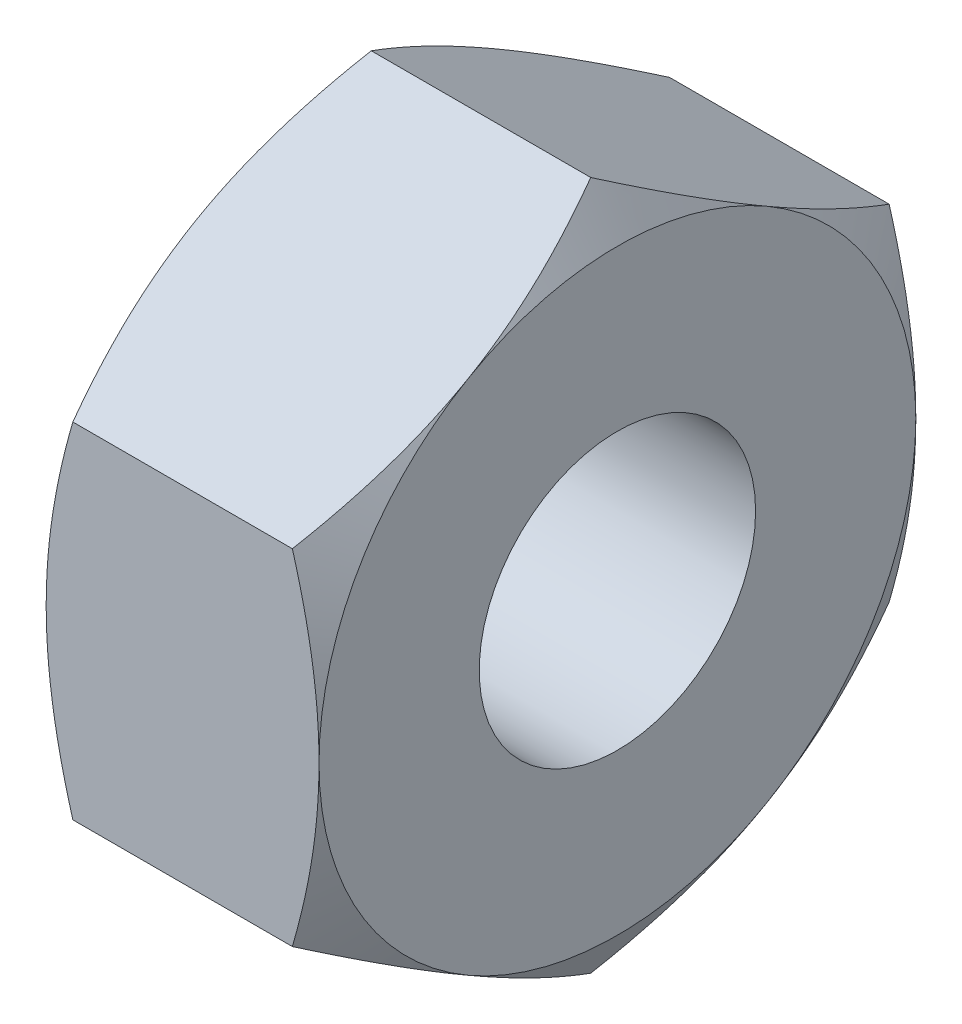
ISO-10303-21;
HEADER;
FILE_DESCRIPTION(('STEP AP214'),'2;1');
FILE_NAME('part.step','',(''),(''),'','','');
FILE_SCHEMA(('AUTOMOTIVE_DESIGN { 1 0 10303 214 1 1 1 1 }'));
ENDSEC;
DATA;
#1=APPLICATION_CONTEXT('core data for automotive mechanical design processes');
#2=APPLICATION_PROTOCOL_DEFINITION('international standard','automotive_design',2000,#1);
#3=PRODUCT_CONTEXT('',#1,'mechanical');
#4=PRODUCT('Part','Part','',(#3));
#5=PRODUCT_RELATED_PRODUCT_CATEGORY('part','',(#4));
#6=PRODUCT_DEFINITION_FORMATION('','',#4);
#7=PRODUCT_DEFINITION_CONTEXT('part definition',#1,'design');
#8=PRODUCT_DEFINITION('design','',#6,#7);
#9=PRODUCT_DEFINITION_SHAPE('','',#8);
#10=(LENGTH_UNIT() NAMED_UNIT(*) SI_UNIT(.MILLI.,.METRE.));
#11=(NAMED_UNIT(*) PLANE_ANGLE_UNIT() SI_UNIT($,.RADIAN.));
#12=(NAMED_UNIT(*) SI_UNIT($,.STERADIAN.) SOLID_ANGLE_UNIT());
#13=UNCERTAINTY_MEASURE_WITH_UNIT(LENGTH_MEASURE(1.E-05),#10,'distance_accuracy_value','');
#14=(GEOMETRIC_REPRESENTATION_CONTEXT(3) GLOBAL_UNCERTAINTY_ASSIGNED_CONTEXT((#13)) GLOBAL_UNIT_ASSIGNED_CONTEXT((#10,
#11,#12)) REPRESENTATION_CONTEXT('',''));
#15=CARTESIAN_POINT('',(0.,0.,0.));
#16=DIRECTION('',(0.,0.,1.));
#17=DIRECTION('',(1.,0.,0.));
#18=AXIS2_PLACEMENT_3D('',#15,#16,#17);
#19=CARTESIAN_POINT('',(3.2,2.02072594216369,-3.5));
#20=DIRECTION('',(0.,-0.866025403784439,0.5));
#21=DIRECTION('',(0.,-0.5,-0.866025403784439));
#22=AXIS2_PLACEMENT_3D('',#19,#20,#21);
#23=PLANE('',#22);
#24=CARTESIAN_POINT('',(2.88732593930663,2.02061047210985,-3.5002));
#25=CARTESIAN_POINT('',(2.93861421101002,2.10941108799268,-3.34639282154755));
#26=CARTESIAN_POINT('',(2.9852590461838,2.1989782252291,-3.19125798916558));
#27=CARTESIAN_POINT('',(3.06667812446665,2.37966345361545,-2.87830199342322));
#28=CARTESIAN_POINT('',(3.10142356441544,2.47078475532383,-2.7204752692125));
#29=CARTESIAN_POINT('',(3.15550997281716,2.65189807961074,-2.40677778961987));
#30=CARTESIAN_POINT('',(3.17521091373962,2.741862235454,-2.2509553008393));
#31=CARTESIAN_POINT('',(3.19872986726274,2.92221386641056,-1.93857711279462));
#32=CARTESIAN_POINT('',(3.20256735545443,3.01260068598001,-1.78202254896576));
#33=CARTESIAN_POINT('',(3.19458469812302,3.1814939814933,-1.489490780079));
#34=CARTESIAN_POINT('',(3.18472456593039,3.26002573814993,-1.35346978754209));
#35=CARTESIAN_POINT('',(3.15347353310059,3.41657761679355,-1.082313979711));
#36=CARTESIAN_POINT('',(3.1320719567142,3.49459719728458,-0.947180102315312));
#37=CARTESIAN_POINT('',(3.07856959211942,3.65147186489429,-0.675465207594812));
#38=CARTESIAN_POINT('',(3.04624200555491,3.73030709667644,-0.538918580721662));
#39=CARTESIAN_POINT('',(2.972871066192,3.88680174018325,-0.267861907055496));
#40=CARTESIAN_POINT('',(2.93184495343013,3.96446315689009,-0.13334838753146));
#41=CARTESIAN_POINT('',(2.88732593930663,4.04156735438121,0.0002000000000068));
#42=B_SPLINE_CURVE_WITH_KNOTS('',3,(#24,#25,#26,#27,#28,#29,#30,#31,#32,#33,#34,#35,#36,#37,#38,
#39,#40,#41),.UNSPECIFIED.,.F.,.F.,(4,2,2,2,2,2,2,2,4),(0.,0.554793832886255,1.11092123814984,
1.65328467083219,2.19498204478404,2.66665130850861,3.13875761298268,3.6213361260051,
4.10296698719187),.UNSPECIFIED.);
#43=CARTESIAN_POINT('',(2.88739260883036,2.02072594216369,-3.5));
#44=VERTEX_POINT('',#43);
#45=CARTESIAN_POINT('',(3.2,3.03108891324553,-1.75));
#46=VERTEX_POINT('',#45);
#47=EDGE_CURVE('E108',#44,#46,#42,.T.);
#48=ORIENTED_EDGE('',*,*,#47,.F.);
#49=DIRECTION('',(-1.,0.,0.));
#50=VECTOR('',#49,1.);
#51=CARTESIAN_POINT('',(3.2,2.02072594216369,-3.5));
#52=LINE('',#51,#50);
#53=CARTESIAN_POINT('',(0.312607391169634,2.02072594216369,-3.5));
#54=VERTEX_POINT('',#53);
#55=EDGE_CURVE('E208',#44,#54,#52,.T.);
#56=ORIENTED_EDGE('',*,*,#55,.T.);
#57=CARTESIAN_POINT('',(0.312674060693368,4.04156735438121,0.000200000000007105));
#58=CARTESIAN_POINT('',(0.261385788989984,3.9527667384984,-0.153607178452447));
#59=CARTESIAN_POINT('',(0.214740953816199,3.86319960126198,-0.308742010834422));
#60=CARTESIAN_POINT('',(0.133321875533352,3.68251437287563,-0.62169800657678));
#61=CARTESIAN_POINT('',(0.0985764355845637,3.59139307116725,-0.779524730787494));
#62=CARTESIAN_POINT('',(0.0444900271828388,3.41027974688034,-1.09322221038013));
#63=CARTESIAN_POINT('',(0.0247890862603851,3.32031559103709,-1.24904469916069));
#64=CARTESIAN_POINT('',(0.00127013273725455,3.13996396008052,-1.56142288720537));
#65=CARTESIAN_POINT('',(-0.00256735545443886,3.04957714051106,-1.71797745103422));
#66=CARTESIAN_POINT('',(0.00541530187697411,2.88068384499777,-2.01050921992098));
#67=CARTESIAN_POINT('',(0.0152754340696072,2.80215208834115,-2.1465302124579));
#68=CARTESIAN_POINT('',(0.046526466899406,2.64560020969754,-2.41768602028899));
#69=CARTESIAN_POINT('',(0.0679280432857993,2.5675806292065,-2.55281989768468));
#70=CARTESIAN_POINT('',(0.121430407880577,2.41070596159679,-2.82453479240518));
#71=CARTESIAN_POINT('',(0.153757994445088,2.33187072981464,-2.96108141927833));
#72=CARTESIAN_POINT('',(0.227128933807994,2.17537608630784,-3.2321380929445));
#73=CARTESIAN_POINT('',(0.268155046569864,2.09771466960099,-3.36665161246853));
#74=CARTESIAN_POINT('',(0.312674060693362,2.02061047210986,-3.5002));
#75=B_SPLINE_CURVE_WITH_KNOTS('',3,(#57,#58,#59,#60,#61,#62,#63,#64,#65,#66,#67,#68,#69,#70,#71,
#72,#73,#74),.UNSPECIFIED.,.F.,.F.,(4,2,2,2,2,2,2,2,4),(0.,0.554793832886252,1.11092123814983,
1.65328467083218,2.19498204478403,2.6666513085086,3.13875761298267,3.62133612600509,
4.10296698719187),.UNSPECIFIED.);
#76=CARTESIAN_POINT('',(0.,3.03108891324553,-1.75));
#77=VERTEX_POINT('',#76);
#78=EDGE_CURVE('E246',#77,#54,#75,.T.);
#79=ORIENTED_EDGE('',*,*,#78,.F.);
#80=CARTESIAN_POINT('',(0.312607391169639,4.04145188432738,0.));
#81=VERTEX_POINT('',#80);
#82=EDGE_CURVE('E251',#81,#77,#75,.T.);
#83=ORIENTED_EDGE('',*,*,#82,.F.);
#84=DIRECTION('',(-1.,0.,0.));
#85=VECTOR('',#84,1.);
#86=CARTESIAN_POINT('',(3.2,4.04145188432738,0.));
#87=LINE('',#86,#85);
#88=CARTESIAN_POINT('',(2.88739260883036,4.04145188432738,0.));
#89=VERTEX_POINT('',#88);
#90=EDGE_CURVE('E131',#89,#81,#87,.T.);
#91=ORIENTED_EDGE('',*,*,#90,.F.);
#92=EDGE_CURVE('E118',#46,#89,#42,.T.);
#93=ORIENTED_EDGE('',*,*,#92,.F.);
#94=EDGE_LOOP('',(#48,#56,#79,#83,#91,#93));
#95=FACE_BOUND('',#94,.T.);
#96=ADVANCED_FACE('F16',(#95),#23,.F.);
#97=CARTESIAN_POINT('',(3.2,4.04145188432738,0.));
#98=DIRECTION('',(0.,-0.866025403784439,-0.5));
#99=DIRECTION('',(0.,0.5,-0.866025403784439));
#100=AXIS2_PLACEMENT_3D('',#97,#98,#99);
#101=PLANE('',#100);
#102=CARTESIAN_POINT('',(2.88732593930663,4.04156735438121,-0.000199999999992962));
#103=CARTESIAN_POINT('',(2.93861421101002,3.9527667384984,0.153607178452456));
#104=CARTESIAN_POINT('',(2.98525904618381,3.86319960126197,0.30874201083443));
#105=CARTESIAN_POINT('',(3.06667812446665,3.68251437287562,0.621698006576787));
#106=CARTESIAN_POINT('',(3.10142356441544,3.59139307116725,0.779524730787502));
#107=CARTESIAN_POINT('',(3.15550997281717,3.41027974688033,1.09322221038013));
#108=CARTESIAN_POINT('',(3.17521091373962,3.32031559103707,1.2490446991607));
#109=CARTESIAN_POINT('',(3.19872986726275,3.13996396008051,1.56142288720538));
#110=CARTESIAN_POINT('',(3.20256735545443,3.04957714051106,1.71797745103424));
#111=CARTESIAN_POINT('',(3.19458469812302,2.88068384499777,2.010509219921));
#112=CARTESIAN_POINT('',(3.18472456593039,2.80215208834114,2.14653021245791));
#113=CARTESIAN_POINT('',(3.1534735331006,2.64560020969753,2.417686020289));
#114=CARTESIAN_POINT('',(3.1320719567142,2.56758062920649,2.55281989768469));
#115=CARTESIAN_POINT('',(3.07856959211942,2.41070596159678,2.82453479240519));
#116=CARTESIAN_POINT('',(3.04624200555491,2.33187072981463,2.96108141927834));
#117=CARTESIAN_POINT('',(2.97287106619201,2.17537608630783,3.2321380929445));
#118=CARTESIAN_POINT('',(2.93184495343013,2.09771466960098,3.36665161246854));
#119=CARTESIAN_POINT('',(2.88732593930663,2.02061047210985,3.5002));
#120=B_SPLINE_CURVE_WITH_KNOTS('',3,(#102,#103,#104,#105,#106,#107,#108,#109,#110,#111,#112,
#113,#114,#115,#116,#117,#118,#119),.UNSPECIFIED.,.F.,.F.,(4,2,2,2,2,2,2,2,4),(0.,
0.554793832886254,1.11092123814984,1.65328467083219,2.19498204478403,2.6666513085086,
3.13875761298267,3.62133612600509,4.10296698719186),.UNSPECIFIED.);
#121=CARTESIAN_POINT('',(3.2,3.03108891324553,1.75));
#122=VERTEX_POINT('',#121);
#123=EDGE_CURVE('E123',#89,#122,#120,.T.);
#124=ORIENTED_EDGE('',*,*,#123,.F.);
#125=ORIENTED_EDGE('',*,*,#90,.T.);
#126=CARTESIAN_POINT('',(0.312674060693366,2.02061047210986,3.5002));
#127=CARTESIAN_POINT('',(0.26138578898998,2.10941108799267,3.34639282154755));
#128=CARTESIAN_POINT('',(0.214740953816194,2.19897822522909,3.19125798916557));
#129=CARTESIAN_POINT('',(0.133321875533347,2.37966345361545,2.87830199342321));
#130=CARTESIAN_POINT('',(0.0985764355845597,2.47078475532382,2.7204752692125));
#131=CARTESIAN_POINT('',(0.0444900271828345,2.65189807961074,2.40677778961987));
#132=CARTESIAN_POINT('',(0.0247890862603799,2.74186223545399,2.2509553008393));
#133=CARTESIAN_POINT('',(0.00127013273725334,2.92221386641056,1.93857711279462));
#134=CARTESIAN_POINT('',(-0.00256735545443517,3.01260068598002,1.78202254896576));
#135=CARTESIAN_POINT('',(0.00541530187697764,3.1814939814933,1.489490780079));
#136=CARTESIAN_POINT('',(0.0152754340696068,3.26002573814993,1.35346978754209));
#137=CARTESIAN_POINT('',(0.0465264668994029,3.41657761679354,1.082313979711));
#138=CARTESIAN_POINT('',(0.0679280432857975,3.49459719728458,0.947180102315315));
#139=CARTESIAN_POINT('',(0.121430407880576,3.65147186489429,0.675465207594817));
#140=CARTESIAN_POINT('',(0.153757994445086,3.73030709667643,0.538918580721666));
#141=CARTESIAN_POINT('',(0.227128933807992,3.88680174018324,0.267861907055502));
#142=CARTESIAN_POINT('',(0.268155046569864,3.96446315689008,0.133348387531469));
#143=CARTESIAN_POINT('',(0.312674060693367,4.04156735438121,-0.00019999999999292));
#144=B_SPLINE_CURVE_WITH_KNOTS('',3,(#126,#127,#128,#129,#130,#131,#132,#133,#134,#135,#136,
#137,#138,#139,#140,#141,#142,#143),.UNSPECIFIED.,.F.,.F.,(4,2,2,2,2,2,2,2,4),(0.,
0.554793832886255,1.11092123814984,1.65328467083219,2.19498204478403,2.6666513085086,
3.13875761298267,3.62133612600509,4.10296698719186),.UNSPECIFIED.);
#145=CARTESIAN_POINT('',(0.,3.03108891324554,1.75));
#146=VERTEX_POINT('',#145);
#147=EDGE_CURVE('E200',#146,#81,#144,.T.);
#148=ORIENTED_EDGE('',*,*,#147,.F.);
#149=CARTESIAN_POINT('',(0.312607391169638,2.02072594216369,3.5));
#150=VERTEX_POINT('',#149);
#151=EDGE_CURVE('E263',#150,#146,#144,.T.);
#152=ORIENTED_EDGE('',*,*,#151,.F.);
#153=DIRECTION('',(-1.,0.,0.));
#154=VECTOR('',#153,1.);
#155=CARTESIAN_POINT('',(3.2,2.02072594216369,3.5));
#156=LINE('',#155,#154);
#157=CARTESIAN_POINT('',(2.88739260883036,2.02072594216369,3.5));
#158=VERTEX_POINT('',#157);
#159=EDGE_CURVE('E219',#158,#150,#156,.T.);
#160=ORIENTED_EDGE('',*,*,#159,.F.);
#161=EDGE_CURVE('E132',#122,#158,#120,.T.);
#162=ORIENTED_EDGE('',*,*,#161,.F.);
#163=EDGE_LOOP('',(#124,#125,#148,#152,#160,#162));
#164=FACE_BOUND('',#163,.T.);
#165=ADVANCED_FACE('F185',(#164),#101,.F.);
#166=CARTESIAN_POINT('',(3.2,2.02072594216369,3.5));
#167=DIRECTION('',(0.,0.,-1.));
#168=DIRECTION('',(0.,1.,0.));
#169=AXIS2_PLACEMENT_3D('',#166,#167,#168);
#170=PLANE('',#169);
#171=CARTESIAN_POINT('',(1.44347007249662,-5.52747552819576,3.5));
#172=CARTESIAN_POINT('',(1.51844717307556,-5.37372622942801,3.50000000000001));
#173=CARTESIAN_POINT('',(1.59273353415013,-5.21963446574166,3.50000000000001));
#174=CARTESIAN_POINT('',(1.73953812245554,-4.91058421754992,3.50000000000001));
#175=CARTESIAN_POINT('',(1.81205608917758,-4.75562560943087,3.50000000000001));
#176=CARTESIAN_POINT('',(1.95528096830742,-4.4439084093338,3.50000000000001));
#177=CARTESIAN_POINT('',(2.02597669970993,-4.28714466296952,3.50000000000001));
#178=CARTESIAN_POINT('',(2.16460453031009,-3.97240446581529,3.50000000000001));
#179=CARTESIAN_POINT('',(2.23253675382692,-3.81442806995849,3.50000000000001));
#180=CARTESIAN_POINT('',(2.36717547077697,-3.49158188309471,3.50000000000001));
#181=CARTESIAN_POINT('',(2.43376050209091,-3.32666117073992,3.50000000000001));
#182=CARTESIAN_POINT('',(2.56212797101081,-2.99492744280661,3.50000000000001));
#183=CARTESIAN_POINT('',(2.6239098839377,-2.82811422277029,3.50000000000001));
#184=CARTESIAN_POINT('',(2.74112201247845,-2.49261126726255,3.50000000000001));
#185=CARTESIAN_POINT('',(2.79656426257449,-2.32392577723553,3.50000000000001));
#186=CARTESIAN_POINT('',(2.89938430337881,-1.98413704064264,3.50000000000001));
#187=CARTESIAN_POINT('',(2.9467645305272,-1.81303454151598,3.5));
#188=CARTESIAN_POINT('',(3.03100086845278,-1.46926530405376,3.5));
#189=CARTESIAN_POINT('',(3.06791646176417,-1.29661340719396,3.5));
#190=CARTESIAN_POINT('',(3.12920355544621,-0.949062219267464,3.50000000000001));
#191=CARTESIAN_POINT('',(3.15357644215679,-0.774163178767812,3.5));
#192=CARTESIAN_POINT('',(3.18752012223861,-0.425315012837524,3.5));
#193=CARTESIAN_POINT('',(3.19728891338472,-0.251385641598594,3.5));
#194=CARTESIAN_POINT('',(3.20172425462781,0.0966848827767267,3.5));
#195=CARTESIAN_POINT('',(3.19639061557001,0.270826038538368,3.5));
#196=CARTESIAN_POINT('',(3.17511676381854,0.563556219191367,3.5));
#197=CARTESIAN_POINT('',(3.1630262795363,0.682444447104689,3.5));
#198=CARTESIAN_POINT('',(3.13250644883793,0.919409772611321,3.5));
#199=CARTESIAN_POINT('',(3.11407632434137,1.03748676882484,3.5));
#200=CARTESIAN_POINT('',(3.05023917047793,1.39030731524242,3.5));
#201=CARTESIAN_POINT('',(2.99629478055011,1.62352663458405,3.5));
#202=CARTESIAN_POINT('',(2.90198374629422,1.97246374212532,3.5));
#203=CARTESIAN_POINT('',(2.86784291317551,2.08996778731766,3.5));
#204=CARTESIAN_POINT('',(2.7958247325867,2.32383631923273,3.5));
#205=CARTESIAN_POINT('',(2.75794735576286,2.44020079699529,3.5));
#206=CARTESIAN_POINT('',(2.67907960956253,2.67182485902201,3.5));
#207=CARTESIAN_POINT('',(2.63809008860558,2.78708473483687,3.5));
#208=CARTESIAN_POINT('',(2.55349925249791,3.01663563833897,3.5));
#209=CARTESIAN_POINT('',(2.50989800076801,3.13092668947538,3.5));
#210=CARTESIAN_POINT('',(2.38763495015913,3.44242387117393,3.5));
#211=CARTESIAN_POINT('',(2.30677915380019,3.63876810673246,3.5));
#212=CARTESIAN_POINT('',(2.14021128017683,4.02939361773509,3.5));
#213=CARTESIAN_POINT('',(2.05449863076715,4.22367464691572,3.5));
#214=CARTESIAN_POINT('',(1.87938669166086,4.61064862479035,3.5));
#215=CARTESIAN_POINT('',(1.78998605555321,4.80334096212263,3.5));
#216=CARTESIAN_POINT('',(1.60838432232882,5.18740432133653,3.49999999999999));
#217=CARTESIAN_POINT('',(1.51618313576482,5.37877530077498,3.49999999999999));
#218=CARTESIAN_POINT('',(1.32945163217988,5.76076297601777,3.49999999999999));
#219=CARTESIAN_POINT('',(1.23491775396072,5.95137792730075,3.49999999999999));
#220=CARTESIAN_POINT('',(1.04412006233258,6.33174098662073,3.49999999999999));
#221=CARTESIAN_POINT('',(0.947856230125404,6.52148908521012,3.49999999999999));
#222=CARTESIAN_POINT('',(0.657050938640539,7.08958847589595,3.49999999999999));
#223=CARTESIAN_POINT('',(0.460450936602842,7.46688549599338,3.49999999999999));
#224=CARTESIAN_POINT('',(0.0850737052660833,8.17883115472203,3.49999999999999));
#225=CARTESIAN_POINT('',(-0.0933304483908556,8.51367746823759,3.49999999999999));
#226=CARTESIAN_POINT('',(-0.452270184164182,9.18225339251811,3.49999999999999));
#227=CARTESIAN_POINT('',(-0.632805904983128,9.51598292877988,3.49999999999999));
#228=CARTESIAN_POINT('',(-0.994821508577027,10.1814287091802,3.49999999999999));
#229=CARTESIAN_POINT('',(-1.17629594407262,10.5131479214205,3.49999999999998));
#230=CARTESIAN_POINT('',(-1.54044809319758,11.1758898576765,3.49999999999999));
#231=CARTESIAN_POINT('',(-1.72312570629229,11.5069126369098,3.49999999999999));
#232=CARTESIAN_POINT('',(-1.90624045241285,11.8376919189625,3.5));
#233=B_SPLINE_CURVE_WITH_KNOTS('',3,(#171,#172,#173,#174,#175,#176,#177,#178,#179,#180,#181,
#182,#183,#184,#185,#186,#187,#188,#189,#190,#191,#192,#193,#194,#195,#196,#197,#198,#199,#200,
#201,#202,#203,#204,#205,#206,#207,#208,#209,#210,#211,#212,#213,#214,#215,#216,#217,#218,#219,
#220,#221,#222,#223,#224,#225,#226,#227,#228,#229,#230,#231,#232),.UNSPECIFIED.,.F.,.F.,(4,2,2,
2,2,2,2,2,2,2,2,2,2,2,2,2,2,2,2,2,2,2,2,2,2,2,2,2,2,2,4),(0.,0.513176065968774,1.02642727863607,
1.54230782313467,2.0581651345032,2.59167231100648,3.12523768467524,3.65777276764035,
4.19014662516369,4.71943076454302,5.24865638980307,5.77063972476672,6.29262959749125,
6.65096196839925,7.00933833406705,7.72643202890317,8.09348824670021,8.46054734826539,
8.82750674056804,9.19445722558125,9.83138168024822,10.4683813222796,11.1056156148603,
11.7428702816196,12.3811667165831,13.0194700916664,14.2957736419782,15.4339885701987,
16.5722779755783,17.7066189546708,18.8408663239037),.UNSPECIFIED.);
#234=CARTESIAN_POINT('',(3.2,0.,3.5));
#235=VERTEX_POINT('',#234);
#236=EDGE_CURVE('E179',#158,#235,#233,.F.);
#237=ORIENTED_EDGE('',*,*,#236,.F.);
#238=ORIENTED_EDGE('',*,*,#159,.T.);
#239=CARTESIAN_POINT('',(1.75652992750337,-5.52747552819576,3.5));
#240=CARTESIAN_POINT('',(1.68155282692443,-5.37372622942801,3.50000000000001));
#241=CARTESIAN_POINT('',(1.60726646584986,-5.21963446574166,3.50000000000001));
#242=CARTESIAN_POINT('',(1.46046187754446,-4.91058421754991,3.50000000000001));
#243=CARTESIAN_POINT('',(1.38794391082242,-4.75562560943087,3.50000000000001));
#244=CARTESIAN_POINT('',(1.24471903169258,-4.4439084093338,3.50000000000001));
#245=CARTESIAN_POINT('',(1.17402330029007,-4.28714466296952,3.50000000000001));
#246=CARTESIAN_POINT('',(1.03539546968991,-3.97240446581529,3.50000000000001));
#247=CARTESIAN_POINT('',(0.967463246173074,-3.81442806995849,3.50000000000001));
#248=CARTESIAN_POINT('',(0.83282452922303,-3.49158188309471,3.50000000000001));
#249=CARTESIAN_POINT('',(0.766239497909093,-3.32666117073992,3.50000000000001));
#250=CARTESIAN_POINT('',(0.637872028989195,-2.99492744280661,3.50000000000001));
#251=CARTESIAN_POINT('',(0.576090116062302,-2.82811422277029,3.50000000000001));
#252=CARTESIAN_POINT('',(0.458877987521551,-2.49261126726255,3.50000000000001));
#253=CARTESIAN_POINT('',(0.403435737425514,-2.32392577723553,3.50000000000001));
#254=CARTESIAN_POINT('',(0.300615696621188,-1.98413704064264,3.50000000000001));
#255=CARTESIAN_POINT('',(0.253235469472804,-1.81303454151598,3.5));
#256=CARTESIAN_POINT('',(0.168999131547217,-1.46926530405376,3.5));
#257=CARTESIAN_POINT('',(0.132083538235827,-1.29661340719396,3.5));
#258=CARTESIAN_POINT('',(0.0707964445537952,-0.949062219267464,3.50000000000001));
#259=CARTESIAN_POINT('',(0.0464235578432055,-0.774163178767812,3.5));
#260=CARTESIAN_POINT('',(0.0124798777613912,-0.425315012837525,3.5));
#261=CARTESIAN_POINT('',(0.00271108661527796,-0.251385641598594,3.5));
#262=CARTESIAN_POINT('',(-0.0017242546278113,0.0966848827767262,3.5));
#263=CARTESIAN_POINT('',(0.00360938442998806,0.270826038538367,3.5));
#264=CARTESIAN_POINT('',(0.0248832361814549,0.563556219191366,3.5));
#265=CARTESIAN_POINT('',(0.0369737204637026,0.682444447104688,3.5));
#266=CARTESIAN_POINT('',(0.067493551162068,0.919409772611319,3.5));
#267=CARTESIAN_POINT('',(0.0859236756586289,1.03748676882484,3.5));
#268=CARTESIAN_POINT('',(0.149760829522069,1.39030731524242,3.5));
#269=CARTESIAN_POINT('',(0.203705219449894,1.62352663458404,3.5));
#270=CARTESIAN_POINT('',(0.298016253705779,1.97246374212532,3.5));
#271=CARTESIAN_POINT('',(0.332157086824486,2.08996778731766,3.5));
#272=CARTESIAN_POINT('',(0.404175267413304,2.32383631923273,3.5));
#273=CARTESIAN_POINT('',(0.442052644237142,2.44020079699529,3.5));
#274=CARTESIAN_POINT('',(0.520920390437471,2.67182485902201,3.5));
#275=CARTESIAN_POINT('',(0.56190991139442,2.78708473483687,3.5));
#276=CARTESIAN_POINT('',(0.646500747502091,3.01663563833897,3.5));
#277=CARTESIAN_POINT('',(0.690101999231983,3.13092668947537,3.5));
#278=CARTESIAN_POINT('',(0.812365049840863,3.44242387117393,3.5));
#279=CARTESIAN_POINT('',(0.893220846199805,3.63876810673246,3.5));
#280=CARTESIAN_POINT('',(1.05978871982317,4.02939361773509,3.5));
#281=CARTESIAN_POINT('',(1.14550136923285,4.22367464691572,3.5));
#282=CARTESIAN_POINT('',(1.32061330833914,4.61064862479034,3.5));
#283=CARTESIAN_POINT('',(1.41001394444678,4.80334096212262,3.5));
#284=CARTESIAN_POINT('',(1.59161567767118,5.18740432133652,3.49999999999999));
#285=CARTESIAN_POINT('',(1.68381686423518,5.37877530077497,3.49999999999999));
#286=CARTESIAN_POINT('',(1.87054836782012,5.76076297601776,3.49999999999999));
#287=CARTESIAN_POINT('',(1.96508224603928,5.95137792730074,3.49999999999999));
#288=CARTESIAN_POINT('',(2.15587993766742,6.33174098662072,3.49999999999999));
#289=CARTESIAN_POINT('',(2.25214376987459,6.52148908521011,3.49999999999999));
#290=CARTESIAN_POINT('',(2.54294906135945,7.08958847589593,3.49999999999999));
#291=CARTESIAN_POINT('',(2.73954906339715,7.46688549599336,3.49999999999999));
#292=CARTESIAN_POINT('',(3.11492629473391,8.17883115472202,3.49999999999999));
#293=CARTESIAN_POINT('',(3.29333044839085,8.51367746823757,3.49999999999999));
#294=CARTESIAN_POINT('',(3.65227018416417,9.1822533925181,3.49999999999999));
#295=CARTESIAN_POINT('',(3.83280590498312,9.51598292877987,3.49999999999999));
#296=CARTESIAN_POINT('',(4.19482150857702,10.1814287091802,3.49999999999999));
#297=CARTESIAN_POINT('',(4.37629594407261,10.5131479214205,3.49999999999998));
#298=CARTESIAN_POINT('',(4.74044809319757,11.1758898576764,3.49999999999999));
#299=CARTESIAN_POINT('',(4.92312570629228,11.5069126369098,3.49999999999999));
#300=CARTESIAN_POINT('',(5.10624045241284,11.8376919189625,3.5));
#301=B_SPLINE_CURVE_WITH_KNOTS('',3,(#239,#240,#241,#242,#243,#244,#245,#246,#247,#248,#249,
#250,#251,#252,#253,#254,#255,#256,#257,#258,#259,#260,#261,#262,#263,#264,#265,#266,#267,#268,
#269,#270,#271,#272,#273,#274,#275,#276,#277,#278,#279,#280,#281,#282,#283,#284,#285,#286,#287,
#288,#289,#290,#291,#292,#293,#294,#295,#296,#297,#298,#299,#300),.UNSPECIFIED.,.F.,.F.,(4,2,2,
2,2,2,2,2,2,2,2,2,2,2,2,2,2,2,2,2,2,2,2,2,2,2,2,2,2,2,4),(0.,0.513176065968774,1.02642727863607,
1.54230782313467,2.0581651345032,2.59167231100648,3.12523768467524,3.65777276764034,
4.19014662516369,4.71943076454302,5.24865638980307,5.77063972476672,6.29262959749124,
6.65096196839925,7.00933833406705,7.72643202890316,8.0934882467002,8.46054734826538,
8.82750674056803,9.19445722558124,9.83138168024821,10.4683813222796,11.1056156148603,
11.7428702816196,12.381166716583,13.0194700916664,14.2957736419782,15.4339885701987,
16.5722779755783,17.7066189546708,18.8408663239037),.UNSPECIFIED.);
#302=CARTESIAN_POINT('',(0.,0.,3.5));
#303=VERTEX_POINT('',#302);
#304=EDGE_CURVE('E191',#303,#150,#301,.T.);
#305=ORIENTED_EDGE('',*,*,#304,.F.);
#306=CARTESIAN_POINT('',(0.312607391169637,-2.02072594216368,3.5));
#307=VERTEX_POINT('',#306);
#308=EDGE_CURVE('E198',#307,#303,#301,.T.);
#309=ORIENTED_EDGE('',*,*,#308,.F.);
#310=DIRECTION('',(-1.,0.,0.));
#311=VECTOR('',#310,1.);
#312=CARTESIAN_POINT('',(3.2,-2.02072594216368,3.5));
#313=LINE('',#312,#311);
#314=CARTESIAN_POINT('',(2.88739260883036,-2.02072594216368,3.5));
#315=VERTEX_POINT('',#314);
#316=EDGE_CURVE('E217',#315,#307,#313,.T.);
#317=ORIENTED_EDGE('',*,*,#316,.F.);
#318=EDGE_CURVE('E174',#235,#315,#233,.F.);
#319=ORIENTED_EDGE('',*,*,#318,.F.);
#320=EDGE_LOOP('',(#237,#238,#305,#309,#317,#319));
#321=FACE_BOUND('',#320,.T.);
#322=ADVANCED_FACE('F181',(#321),#170,.F.);
#323=CARTESIAN_POINT('',(3.2,-2.02072594216368,3.5));
#324=DIRECTION('',(0.,0.86602540378444,-0.5));
#325=DIRECTION('',(0.,0.5,0.86602540378444));
#326=AXIS2_PLACEMENT_3D('',#323,#324,#325);
#327=PLANE('',#326);
#328=CARTESIAN_POINT('',(2.88732593930663,-2.02061047210984,3.5002));
#329=CARTESIAN_POINT('',(2.93861421101002,-2.10941108799266,3.34639282154755));
#330=CARTESIAN_POINT('',(2.98525904618381,-2.19897822522908,3.19125798916558));
#331=CARTESIAN_POINT('',(3.06667812446666,-2.37966345361544,2.87830199342322));
#332=CARTESIAN_POINT('',(3.10142356441544,-2.47078475532381,2.7204752692125));
#333=CARTESIAN_POINT('',(3.15550997281717,-2.65189807961072,2.40677778961987));
#334=CARTESIAN_POINT('',(3.17521091373963,-2.74186223545398,2.25095530083931));
#335=CARTESIAN_POINT('',(3.19872986726275,-2.92221386641054,1.93857711279463));
#336=CARTESIAN_POINT('',(3.20256735545444,-3.01260068598,1.78202254896577));
#337=CARTESIAN_POINT('',(3.19458469812303,-3.18149398149328,1.48949078007901));
#338=CARTESIAN_POINT('',(3.1847245659304,-3.26002573814992,1.35346978754209));
#339=CARTESIAN_POINT('',(3.1534735331006,-3.41657761679353,1.082313979711));
#340=CARTESIAN_POINT('',(3.13207195671421,-3.49459719728457,0.947180102315311));
#341=CARTESIAN_POINT('',(3.07856959211943,-3.65147186489428,0.675465207594808));
#342=CARTESIAN_POINT('',(3.04624200555492,-3.73030709667643,0.538918580721656));
#343=CARTESIAN_POINT('',(2.97287106619201,-3.88680174018323,0.267861907055487));
#344=CARTESIAN_POINT('',(2.93184495343014,-3.96446315689008,0.13334838753145));
#345=CARTESIAN_POINT('',(2.88732593930663,-4.04156735438121,-0.000200000000015943));
#346=B_SPLINE_CURVE_WITH_KNOTS('',3,(#328,#329,#330,#331,#332,#333,#334,#335,#336,#337,#338,
#339,#340,#341,#342,#343,#344,#345),.UNSPECIFIED.,.F.,.F.,(4,2,2,2,2,2,2,2,4),(0.,
0.554793832886254,1.11092123814984,1.65328467083219,2.19498204478403,2.6666513085086,
3.13875761298268,3.62133612600511,4.10296698719189),.UNSPECIFIED.);
#347=CARTESIAN_POINT('',(3.2,-3.03108891324554,1.75));
#348=VERTEX_POINT('',#347);
#349=EDGE_CURVE('E180',#315,#348,#346,.T.);
#350=ORIENTED_EDGE('',*,*,#349,.F.);
#351=ORIENTED_EDGE('',*,*,#316,.T.);
#352=CARTESIAN_POINT('',(0.312674060693364,-4.04156735438121,-0.000200000000015973));
#353=CARTESIAN_POINT('',(0.261385788989978,-3.95276673849839,0.153607178452435));
#354=CARTESIAN_POINT('',(0.214740953816193,-3.86319960126197,0.30874201083441));
#355=CARTESIAN_POINT('',(0.133321875533345,-3.68251437287562,0.621698006576767));
#356=CARTESIAN_POINT('',(0.0985764355845567,-3.59139307116724,0.779524730787481));
#357=CARTESIAN_POINT('',(0.044490027182831,-3.41027974688033,1.09322221038011));
#358=CARTESIAN_POINT('',(0.0247890862603766,-3.32031559103708,1.24904469916068));
#359=CARTESIAN_POINT('',(0.00127013273724785,-3.13996396008051,1.56142288720536));
#360=CARTESIAN_POINT('',(-0.00256735545444299,-3.04957714051105,1.71797745103421));
#361=CARTESIAN_POINT('',(0.00541530187696918,-2.88068384499777,2.01050921992097));
#362=CARTESIAN_POINT('',(0.0152754340695998,-2.80215208834114,2.14653021245789));
#363=CARTESIAN_POINT('',(0.0465264668993972,-2.64560020969753,2.41768602028898));
#364=CARTESIAN_POINT('',(0.0679280432857917,-2.56758062920649,2.55281989768467));
#365=CARTESIAN_POINT('',(0.121430407880571,-2.41070596159678,2.82453479240518));
#366=CARTESIAN_POINT('',(0.153757994445081,-2.33187072981463,2.96108141927833));
#367=CARTESIAN_POINT('',(0.227128933807989,-2.17537608630782,3.2321380929445));
#368=CARTESIAN_POINT('',(0.268155046569862,-2.09771466960098,3.36665161246853));
#369=CARTESIAN_POINT('',(0.312674060693365,-2.02061047210984,3.5002));
#370=B_SPLINE_CURVE_WITH_KNOTS('',3,(#352,#353,#354,#355,#356,#357,#358,#359,#360,#361,#362,
#363,#364,#365,#366,#367,#368,#369),.UNSPECIFIED.,.F.,.F.,(4,2,2,2,2,2,2,2,4),(0.,
0.554793832886252,1.11092123814983,1.65328467083218,2.19498204478403,2.6666513085086,
3.13875761298268,3.6213361260051,4.10296698719188),.UNSPECIFIED.);
#371=CARTESIAN_POINT('',(0.,-3.03108891324552,1.75));
#372=VERTEX_POINT('',#371);
#373=EDGE_CURVE('E199',#372,#307,#370,.T.);
#374=ORIENTED_EDGE('',*,*,#373,.F.);
#375=CARTESIAN_POINT('',(0.312607391169636,-4.04145188432737,0.));
#376=VERTEX_POINT('',#375);
#377=EDGE_CURVE('E252',#376,#372,#370,.T.);
#378=ORIENTED_EDGE('',*,*,#377,.F.);
#379=DIRECTION('',(-1.,0.,0.));
#380=VECTOR('',#379,1.);
#381=CARTESIAN_POINT('',(3.2,-4.04145188432737,0.));
#382=LINE('',#381,#380);
#383=CARTESIAN_POINT('',(2.88739260883036,-4.04145188432737,0.));
#384=VERTEX_POINT('',#383);
#385=EDGE_CURVE('E215',#384,#376,#382,.T.);
#386=ORIENTED_EDGE('',*,*,#385,.F.);
#387=EDGE_CURVE('E169',#348,#384,#346,.T.);
#388=ORIENTED_EDGE('',*,*,#387,.F.);
#389=EDGE_LOOP('',(#350,#351,#374,#378,#386,#388));
#390=FACE_BOUND('',#389,.T.);
#391=ADVANCED_FACE('F184',(#390),#327,.F.);
#392=CARTESIAN_POINT('',(3.2,-4.04145188432737,0.));
#393=DIRECTION('',(0.,0.866025403784438,0.5));
#394=DIRECTION('',(0.,-0.5,0.866025403784438));
#395=AXIS2_PLACEMENT_3D('',#392,#393,#394);
#396=PLANE('',#395);
#397=CARTESIAN_POINT('',(2.88732593930663,-4.04156735438121,0.000199999999984123));
#398=CARTESIAN_POINT('',(2.93861421101002,-3.95276673849839,-0.153607178452465));
#399=CARTESIAN_POINT('',(2.98525904618381,-3.86319960126197,-0.308742010834439));
#400=CARTESIAN_POINT('',(3.06667812446666,-3.68251437287561,-0.621698006576795));
#401=CARTESIAN_POINT('',(3.10142356441544,-3.59139307116724,-0.77952473078751));
#402=CARTESIAN_POINT('',(3.15550997281717,-3.41027974688033,-1.09322221038014));
#403=CARTESIAN_POINT('',(3.17521091373962,-3.32031559103707,-1.24904469916071));
#404=CARTESIAN_POINT('',(3.19872986726275,-3.13996396008051,-1.56142288720539));
#405=CARTESIAN_POINT('',(3.20256735545443,-3.04957714051105,-1.71797745103424));
#406=CARTESIAN_POINT('',(3.19458469812302,-2.88068384499776,-2.010509219921));
#407=CARTESIAN_POINT('',(3.18472456593039,-2.80215208834114,-2.14653021245792));
#408=CARTESIAN_POINT('',(3.1534735331006,-2.64560020969753,-2.417686020289));
#409=CARTESIAN_POINT('',(3.1320719567142,-2.56758062920649,-2.55281989768469));
#410=CARTESIAN_POINT('',(3.07856959211942,-2.41070596159678,-2.82453479240519));
#411=CARTESIAN_POINT('',(3.04624200555491,-2.33187072981463,-2.96108141927834));
#412=CARTESIAN_POINT('',(2.97287106619201,-2.17537608630783,-3.2321380929445));
#413=CARTESIAN_POINT('',(2.93184495343014,-2.09771466960099,-3.36665161246853));
#414=CARTESIAN_POINT('',(2.88732593930664,-2.02061047210986,-3.5002));
#415=B_SPLINE_CURVE_WITH_KNOTS('',3,(#397,#398,#399,#400,#401,#402,#403,#404,#405,#406,#407,
#408,#409,#410,#411,#412,#413,#414),.UNSPECIFIED.,.F.,.F.,(4,2,2,2,2,2,2,2,4),(0.,
0.554793832886253,1.11092123814983,1.65328467083218,2.19498204478403,2.66665130850859,
3.13875761298266,3.62133612600508,4.10296698719185),.UNSPECIFIED.);
#416=CARTESIAN_POINT('',(3.2,-3.03108891324553,-1.75));
#417=VERTEX_POINT('',#416);
#418=EDGE_CURVE('E465',#384,#417,#415,.T.);
#419=ORIENTED_EDGE('',*,*,#418,.F.);
#420=ORIENTED_EDGE('',*,*,#385,.T.);
#421=CARTESIAN_POINT('',(0.31267406069336,-2.02061047210986,-3.5002));
#422=CARTESIAN_POINT('',(0.261385788989977,-2.10941108799267,-3.34639282154755));
#423=CARTESIAN_POINT('',(0.214740953816193,-2.19897822522909,-3.19125798916557));
#424=CARTESIAN_POINT('',(0.133321875533346,-2.37966345361545,-2.87830199342321));
#425=CARTESIAN_POINT('',(0.0985764355845581,-2.47078475532382,-2.72047526921249));
#426=CARTESIAN_POINT('',(0.0444900271828328,-2.65189807961074,-2.40677778961986));
#427=CARTESIAN_POINT('',(0.0247890862603788,-2.741862235454,-2.2509553008393));
#428=CARTESIAN_POINT('',(0.00127013273725215,-2.92221386641056,-1.93857711279461));
#429=CARTESIAN_POINT('',(-0.0025673554544371,-3.01260068598002,-1.78202254896575));
#430=CARTESIAN_POINT('',(0.00541530187697646,-3.1814939814933,-1.489490780079));
#431=CARTESIAN_POINT('',(0.0152754340696067,-3.26002573814993,-1.35346978754208));
#432=CARTESIAN_POINT('',(0.0465264668994034,-3.41657761679354,-1.082313979711));
#433=CARTESIAN_POINT('',(0.0679280432857976,-3.49459719728458,-0.947180102315314));
#434=CARTESIAN_POINT('',(0.121430407880575,-3.65147186489428,-0.675465207594818));
#435=CARTESIAN_POINT('',(0.153757994445084,-3.73030709667643,-0.538918580721669));
#436=CARTESIAN_POINT('',(0.22712893380799,-3.88680174018323,-0.267861907055508));
#437=CARTESIAN_POINT('',(0.268155046569861,-3.96446315689008,-0.133348387531476));
#438=CARTESIAN_POINT('',(0.312674060693364,-4.04156735438121,0.000199999999984193));
#439=B_SPLINE_CURVE_WITH_KNOTS('',3,(#421,#422,#423,#424,#425,#426,#427,#428,#429,#430,#431,
#432,#433,#434,#435,#436,#437,#438),.UNSPECIFIED.,.F.,.F.,(4,2,2,2,2,2,2,2,4),(0.,
0.554793832886256,1.11092123814984,1.6532846708322,2.19498204478404,2.6666513085086,
3.13875761298267,3.62133612600508,4.10296698719185),.UNSPECIFIED.);
#440=CARTESIAN_POINT('',(0.,-3.03108891324553,-1.75));
#441=VERTEX_POINT('',#440);
#442=EDGE_CURVE('E247',#441,#376,#439,.T.);
#443=ORIENTED_EDGE('',*,*,#442,.F.);
#444=CARTESIAN_POINT('',(0.312607391169549,-2.02072594216382,-3.5));
#445=VERTEX_POINT('',#444);
#446=EDGE_CURVE('E240',#445,#441,#439,.T.);
#447=ORIENTED_EDGE('',*,*,#446,.F.);
#448=DIRECTION('',(-1.,0.,0.));
#449=VECTOR('',#448,1.);
#450=CARTESIAN_POINT('',(3.2,-2.0207259421637,-3.5));
#451=LINE('',#450,#449);
#452=CARTESIAN_POINT('',(2.88739260883045,-2.02072594216382,-3.5));
#453=VERTEX_POINT('',#452);
#454=EDGE_CURVE('E213',#453,#445,#451,.T.);
#455=ORIENTED_EDGE('',*,*,#454,.F.);
#456=EDGE_CURVE('E163',#417,#453,#415,.T.);
#457=ORIENTED_EDGE('',*,*,#456,.F.);
#458=EDGE_LOOP('',(#419,#420,#443,#447,#455,#457));
#459=FACE_BOUND('',#458,.T.);
#460=ADVANCED_FACE('F231',(#459),#396,.F.);
#461=CARTESIAN_POINT('',(3.2,-2.0207259421637,-3.5));
#462=DIRECTION('',(0.,0.,1.));
#463=DIRECTION('',(0.,-1.,0.));
#464=AXIS2_PLACEMENT_3D('',#461,#462,#463);
#465=PLANE('',#464);
#466=CARTESIAN_POINT('',(1.44347006996292,-5.52747553339009,-3.5));
#467=CARTESIAN_POINT('',(1.51844717064733,-5.37372623444739,-3.5));
#468=CARTESIAN_POINT('',(1.59273353182731,-5.21963447058595,-3.5));
#469=CARTESIAN_POINT('',(1.73953812034303,-4.91058422204353,-3.49999999999999));
#470=CARTESIAN_POINT('',(1.81205608716998,-4.75562561374888,-3.5));
#471=CARTESIAN_POINT('',(1.95528096650966,-4.443908413298,-3.5));
#472=CARTESIAN_POINT('',(2.0259766980171,-4.28714466675549,-3.5));
#473=CARTESIAN_POINT('',(2.1646045288254,-3.97240446924362,-3.5));
#474=CARTESIAN_POINT('',(2.23253675244545,-3.81442807320741,-3.5));
#475=CARTESIAN_POINT('',(2.36717546960522,-3.49158188597035,-3.5));
#476=CARTESIAN_POINT('',(2.43376050102542,-3.32666117342156,-3.5));
#477=CARTESIAN_POINT('',(2.56212797015227,-2.99492744509719,-3.5));
#478=CARTESIAN_POINT('',(2.62390988317983,-2.82811422486379,-3.5));
#479=CARTESIAN_POINT('',(2.74112201191246,-2.49261126895828,-3.5));
#480=CARTESIAN_POINT('',(2.79656426209972,-2.32392577873057,-3.5));
#481=CARTESIAN_POINT('',(2.89938430307187,-1.98413704173088,-3.5));
#482=CARTESIAN_POINT('',(2.94676453029685,-1.81303454239811,-3.5));
#483=CARTESIAN_POINT('',(3.03100086837727,-1.46926530441951,-3.5));
#484=CARTESIAN_POINT('',(3.06791646176116,-1.29661340724802,-3.5));
#485=CARTESIAN_POINT('',(3.12920355554145,-0.949062218690439,-3.5));
#486=CARTESIAN_POINT('',(3.15357644227784,-0.774163177871402,-3.5));
#487=CARTESIAN_POINT('',(3.18752012235417,-0.425315011307523,-3.5));
#488=CARTESIAN_POINT('',(3.19728891347009,-0.251385639754457,-3.5));
#489=CARTESIAN_POINT('',(3.20172425459745,0.0966848852445574,-3.5));
#490=CARTESIAN_POINT('',(3.1963906154541,0.270826041315757,-3.5));
#491=CARTESIAN_POINT('',(3.1751167635294,0.563556222354819,-3.5));
#492=CARTESIAN_POINT('',(3.16302627917873,0.682444450348167,-3.5));
#493=CARTESIAN_POINT('',(3.13250644833991,0.919409776011191,-3.50000000000001));
#494=CARTESIAN_POINT('',(3.11407632377132,1.03748677230108,-3.50000000000001));
#495=CARTESIAN_POINT('',(3.05023916969036,1.39030731894347,-3.50000000000001));
#496=CARTESIAN_POINT('',(2.99629477961566,1.62352663842888,-3.50000000000001));
#497=CARTESIAN_POINT('',(2.90198374514323,1.97246374618519,-3.50000000000001));
#498=CARTESIAN_POINT('',(2.86784291195185,2.08996779145081,-3.50000000000001));
#499=CARTESIAN_POINT('',(2.79582473121998,2.32383632351156,-3.50000000000001));
#500=CARTESIAN_POINT('',(2.75794735432577,2.44020080134653,-3.50000000000001));
#501=CARTESIAN_POINT('',(2.6790796079873,2.67182486351749,-3.50000000000001));
#502=CARTESIAN_POINT('',(2.63809008696259,2.7870847394042,-3.50000000000001));
#503=CARTESIAN_POINT('',(2.55349925072183,3.01663564304999,-3.50000000000001));
#504=CARTESIAN_POINT('',(2.50989799892661,3.13092669425824,-3.5));
#505=CARTESIAN_POINT('',(2.38763494820392,3.44242387599606,-3.5));
#506=CARTESIAN_POINT('',(2.30677915180399,3.63876811152425,-3.50000000000001));
#507=CARTESIAN_POINT('',(2.14021127811075,4.02939362247016,-3.50000000000001));
#508=CARTESIAN_POINT('',(2.05449862867219,4.22367465162441,-3.50000000000001));
#509=CARTESIAN_POINT('',(1.87938668951687,4.61064862944914,-3.50000000000001));
#510=CARTESIAN_POINT('',(1.78998605338907,4.8033409667579,-3.50000000000001));
#511=CARTESIAN_POINT('',(1.60838432013053,5.18740432592725,-3.50000000000001));
#512=CARTESIAN_POINT('',(1.51618313355253,5.37877530534468,-3.50000000000001));
#513=CARTESIAN_POINT('',(1.32945162994467,5.76076298054602,-3.50000000000001));
#514=CARTESIAN_POINT('',(1.23491775171661,5.95137793180857,-3.50000000000001));
#515=CARTESIAN_POINT('',(1.04412006007403,6.33174099108923,-3.50000000000001));
#516=CARTESIAN_POINT('',(0.947856227861297,6.52148908965972,-3.50000000000001));
#517=CARTESIAN_POINT('',(0.657050936363241,7.08958848029104,-3.50000000000002));
#518=CARTESIAN_POINT('',(0.460450934321601,7.46688550035461,-3.50000000000002));
#519=CARTESIAN_POINT('',(0.085073702968046,8.17883115904994,-3.50000000000002));
#520=CARTESIAN_POINT('',(-0.0933304507025754,8.51367747256561,-3.50000000000002));
#521=CARTESIAN_POINT('',(-0.452270186500476,9.18225339684764,-3.50000000000002));
#522=CARTESIAN_POINT('',(-0.632805907330312,9.51598293311081,-3.50000000000002));
#523=CARTESIAN_POINT('',(-0.994821510946747,10.1814287135198,-3.50000000000002));
#524=CARTESIAN_POINT('',(-1.17629594645401,10.5131479257672,-3.50000000000002));
#525=CARTESIAN_POINT('',(-1.54044809560108,11.1758898620383,-3.50000000000002));
#526=CARTESIAN_POINT('',(-1.72312570870623,11.5069126412797,-3.50000000000001));
#527=CARTESIAN_POINT('',(-1.90624045483682,11.8376919233406,-3.5));
#528=B_SPLINE_CURVE_WITH_KNOTS('',3,(#466,#467,#468,#469,#470,#471,#472,#473,#474,#475,#476,
#477,#478,#479,#480,#481,#482,#483,#484,#485,#486,#487,#488,#489,#490,#491,#492,#493,#494,#495,
#496,#497,#498,#499,#500,#501,#502,#503,#504,#505,#506,#507,#508,#509,#510,#511,#512,#513,#514,
#515,#516,#517,#518,#519,#520,#521,#522,#523,#524,#525,#526,#527),.UNSPECIFIED.,.F.,.F.,(4,2,2,
2,2,2,2,2,2,2,2,2,2,2,2,2,2,2,2,2,2,2,2,2,2,2,2,2,2,2,4),(0.,0.513176066579231,1.02642727985707,
1.54230782497248,2.05816513695778,2.59167231412002,3.12523768844795,3.65777277207015,
4.19014663025007,4.71943077058729,5.24865639680383,5.77063973269968,6.2926296063568,
6.65096197752437,7.00933834345177,7.72643203880824,8.0934882568773,8.46054735871449,
8.82750675128841,9.19445723657293,9.83138169120306,10.4683813331972,11.1056156257395,
11.7428702924603,12.3811667273807,13.0194701024211,14.2957736526484,15.4339885808885,
16.5722779862873,17.7066189654156,18.8408663346846),.UNSPECIFIED.);
#529=CARTESIAN_POINT('',(3.2,0.,-3.5));
#530=VERTEX_POINT('',#529);
#531=EDGE_CURVE('E294',#453,#530,#528,.T.);
#532=ORIENTED_EDGE('',*,*,#531,.F.);
#533=ORIENTED_EDGE('',*,*,#454,.T.);
#534=CARTESIAN_POINT('',(1.75652993003708,-5.52747553339009,-3.5));
#535=CARTESIAN_POINT('',(1.68155282935267,-5.37372623444739,-3.5));
#536=CARTESIAN_POINT('',(1.60726646817269,-5.21963447058595,-3.5));
#537=CARTESIAN_POINT('',(1.46046187965697,-4.91058422204353,-3.49999999999999));
#538=CARTESIAN_POINT('',(1.38794391283002,-4.75562561374888,-3.5));
#539=CARTESIAN_POINT('',(1.24471903349034,-4.443908413298,-3.5));
#540=CARTESIAN_POINT('',(1.1740233019829,-4.28714466675549,-3.5));
#541=CARTESIAN_POINT('',(1.0353954711746,-3.97240446924362,-3.5));
#542=CARTESIAN_POINT('',(0.967463247554553,-3.81442807320741,-3.5));
#543=CARTESIAN_POINT('',(0.832824530394783,-3.49158188597035,-3.5));
#544=CARTESIAN_POINT('',(0.766239498974577,-3.32666117342156,-3.5));
#545=CARTESIAN_POINT('',(0.637872029847735,-2.99492744509719,-3.5));
#546=CARTESIAN_POINT('',(0.576090116820169,-2.8281142248638,-3.5));
#547=CARTESIAN_POINT('',(0.458877988087543,-2.49261126895828,-3.5));
#548=CARTESIAN_POINT('',(0.403435737900279,-2.32392577873057,-3.5));
#549=CARTESIAN_POINT('',(0.300615696928134,-1.98413704173089,-3.5));
#550=CARTESIAN_POINT('',(0.25323546970315,-1.81303454239812,-3.5));
#551=CARTESIAN_POINT('',(0.168999131622731,-1.46926530441952,-3.5));
#552=CARTESIAN_POINT('',(0.132083538238839,-1.29661340724803,-3.5));
#553=CARTESIAN_POINT('',(0.070796444458547,-0.949062218690442,-3.5));
#554=CARTESIAN_POINT('',(0.0464235577221647,-0.774163177871404,-3.5));
#555=CARTESIAN_POINT('',(0.0124798776458286,-0.425315011307526,-3.5));
#556=CARTESIAN_POINT('',(0.00271108652991089,-0.251385639754459,-3.5));
#557=CARTESIAN_POINT('',(-0.00172425459744959,0.0966848852445562,-3.5));
#558=CARTESIAN_POINT('',(0.00360938454589528,0.270826041315757,-3.5));
#559=CARTESIAN_POINT('',(0.0248832364705938,0.563556222354818,-3.5));
#560=CARTESIAN_POINT('',(0.036973720821274,0.682444450348166,-3.5));
#561=CARTESIAN_POINT('',(0.0674935516600942,0.91940977601119,-3.50000000000001));
#562=CARTESIAN_POINT('',(0.085923676228678,1.03748677230108,-3.50000000000001));
#563=CARTESIAN_POINT('',(0.149760830309644,1.39030731894347,-3.50000000000001));
#564=CARTESIAN_POINT('',(0.203705220384339,1.62352663842888,-3.50000000000001));
#565=CARTESIAN_POINT('',(0.298016254856775,1.97246374618519,-3.50000000000001));
#566=CARTESIAN_POINT('',(0.332157088048155,2.08996779145081,-3.50000000000001));
#567=CARTESIAN_POINT('',(0.404175268780019,2.32383632351155,-3.50000000000001));
#568=CARTESIAN_POINT('',(0.44205264567423,2.44020080134652,-3.50000000000001));
#569=CARTESIAN_POINT('',(0.5209203920127,2.67182486351749,-3.50000000000001));
#570=CARTESIAN_POINT('',(0.561909913037413,2.78708473940419,-3.50000000000001));
#571=CARTESIAN_POINT('',(0.646500749278171,3.01663564304999,-3.50000000000001));
#572=CARTESIAN_POINT('',(0.690102001073387,3.13092669425824,-3.5));
#573=CARTESIAN_POINT('',(0.812365051796074,3.44242387599606,-3.5));
#574=CARTESIAN_POINT('',(0.893220848196013,3.63876811152425,-3.50000000000001));
#575=CARTESIAN_POINT('',(1.05978872188925,4.02939362247016,-3.50000000000001));
#576=CARTESIAN_POINT('',(1.14550137132781,4.22367465162441,-3.50000000000001));
#577=CARTESIAN_POINT('',(1.32061331048313,4.61064862944914,-3.50000000000001));
#578=CARTESIAN_POINT('',(1.41001394661092,4.8033409667579,-3.50000000000001));
#579=CARTESIAN_POINT('',(1.59161567986947,5.18740432592725,-3.50000000000001));
#580=CARTESIAN_POINT('',(1.68381686644747,5.37877530534467,-3.50000000000001));
#581=CARTESIAN_POINT('',(1.87054837005533,5.76076298054601,-3.50000000000001));
#582=CARTESIAN_POINT('',(1.96508224828339,5.95137793180857,-3.50000000000001));
#583=CARTESIAN_POINT('',(2.15587993992597,6.33174099108923,-3.50000000000001));
#584=CARTESIAN_POINT('',(2.2521437721387,6.52148908965971,-3.50000000000001));
#585=CARTESIAN_POINT('',(2.54294906363676,7.08958848029103,-3.50000000000002));
#586=CARTESIAN_POINT('',(2.73954906567839,7.4668855003546,-3.50000000000002));
#587=CARTESIAN_POINT('',(3.11492629703195,8.17883115904993,-3.50000000000002));
#588=CARTESIAN_POINT('',(3.29333045070257,8.5136774725656,-3.50000000000002));
#589=CARTESIAN_POINT('',(3.65227018650047,9.18225339684764,-3.50000000000002));
#590=CARTESIAN_POINT('',(3.83280590733031,9.51598293311081,-3.50000000000002));
#591=CARTESIAN_POINT('',(4.19482151094674,10.1814287135198,-3.50000000000002));
#592=CARTESIAN_POINT('',(4.37629594645401,10.5131479257672,-3.50000000000002));
#593=CARTESIAN_POINT('',(4.74044809560108,11.1758898620383,-3.50000000000002));
#594=CARTESIAN_POINT('',(4.92312570870623,11.5069126412797,-3.50000000000001));
#595=CARTESIAN_POINT('',(5.10624045483681,11.8376919233406,-3.5));
#596=B_SPLINE_CURVE_WITH_KNOTS('',3,(#534,#535,#536,#537,#538,#539,#540,#541,#542,#543,#544,
#545,#546,#547,#548,#549,#550,#551,#552,#553,#554,#555,#556,#557,#558,#559,#560,#561,#562,#563,
#564,#565,#566,#567,#568,#569,#570,#571,#572,#573,#574,#575,#576,#577,#578,#579,#580,#581,#582,
#583,#584,#585,#586,#587,#588,#589,#590,#591,#592,#593,#594,#595),.UNSPECIFIED.,.F.,.F.,(4,2,2,
2,2,2,2,2,2,2,2,2,2,2,2,2,2,2,2,2,2,2,2,2,2,2,2,2,2,2,4),(0.,0.513176066579232,1.02642727985707,
1.54230782497248,2.05816513695777,2.59167231412002,3.12523768844795,3.65777277207014,
4.19014663025007,4.71943077058728,5.24865639680382,5.77063973269967,6.2926296063568,
6.65096197752437,7.00933834345177,7.72643203880824,8.0934882568773,8.46054735871449,
8.82750675128841,9.19445723657293,9.83138169120306,10.4683813331972,11.1056156257395,
11.7428702924603,12.3811667273807,13.0194701024211,14.2957736526484,15.4339885808885,
16.5722779862873,17.7066189654156,18.8408663346846),.UNSPECIFIED.);
#597=CARTESIAN_POINT('',(0.,0.,-3.5));
#598=VERTEX_POINT('',#597);
#599=EDGE_CURVE('E221',#598,#445,#596,.F.);
#600=ORIENTED_EDGE('',*,*,#599,.F.);
#601=EDGE_CURVE('E226',#54,#598,#596,.F.);
#602=ORIENTED_EDGE('',*,*,#601,.F.);
#603=ORIENTED_EDGE('',*,*,#55,.F.);
#604=EDGE_CURVE('E113',#530,#44,#528,.T.);
#605=ORIENTED_EDGE('',*,*,#604,.F.);
#606=EDGE_LOOP('',(#532,#533,#600,#602,#603,#605));
#607=FACE_BOUND('',#606,.T.);
#608=ADVANCED_FACE('F227',(#607),#465,.F.);
#609=CARTESIAN_POINT('',(3.2,0.,0.));
#610=DIRECTION('',(1.,0.,0.));
#611=DIRECTION('',(0.,0.,-1.));
#612=AXIS2_PLACEMENT_3D('',#609,#610,#611);
#613=PLANE('',#612);
#614=CARTESIAN_POINT('',(3.2,0.,0.));
#615=DIRECTION('',(1.,0.,0.));
#616=DIRECTION('',(0.,0.,-1.));
#617=AXIS2_PLACEMENT_3D('',#614,#615,#616);
#618=CIRCLE('',#617,1.621);
#619=CARTESIAN_POINT('',(3.2,0.,-1.621));
#620=VERTEX_POINT('',#619);
#621=EDGE_CURVE('E205',#620,#620,#618,.T.);
#622=ORIENTED_EDGE('',*,*,#621,.F.);
#623=EDGE_LOOP('',(#622));
#624=FACE_BOUND('',#623,.T.);
#625=CARTESIAN_POINT('',(3.2,0.,0.));
#626=DIRECTION('',(1.,0.,0.));
#627=DIRECTION('',(0.,0.,-1.));
#628=AXIS2_PLACEMENT_3D('',#625,#626,#627);
#629=CIRCLE('',#628,3.5);
#630=EDGE_CURVE('E20',#417,#530,#629,.T.);
#631=ORIENTED_EDGE('',*,*,#630,.T.);
#632=CARTESIAN_POINT('',(3.2,0.,0.));
#633=DIRECTION('',(1.,0.,0.));
#634=DIRECTION('',(0.,0.,-1.));
#635=AXIS2_PLACEMENT_3D('',#632,#633,#634);
#636=CIRCLE('',#635,3.5);
#637=EDGE_CURVE('E111',#530,#46,#636,.T.);
#638=ORIENTED_EDGE('',*,*,#637,.T.);
#639=EDGE_CURVE('E11',#46,#122,#629,.T.);
#640=ORIENTED_EDGE('',*,*,#639,.T.);
#641=EDGE_CURVE('E25',#122,#235,#629,.T.);
#642=ORIENTED_EDGE('',*,*,#641,.T.);
#643=EDGE_CURVE('E461',#235,#348,#629,.T.);
#644=ORIENTED_EDGE('',*,*,#643,.T.);
#645=EDGE_CURVE('E462',#348,#417,#629,.T.);
#646=ORIENTED_EDGE('',*,*,#645,.T.);
#647=EDGE_LOOP('',(#631,#638,#640,#642,#644,#646));
#648=FACE_BOUND('',#647,.T.);
#649=ADVANCED_FACE('F127',(#624,#648),#613,.T.);
#650=CARTESIAN_POINT('',(0.,0.,0.));
#651=DIRECTION('',(1.,0.,0.));
#652=DIRECTION('',(0.,0.,-1.));
#653=AXIS2_PLACEMENT_3D('',#650,#651,#652);
#654=PLANE('',#653);
#655=CARTESIAN_POINT('',(0.,0.,0.));
#656=DIRECTION('',(1.,0.,0.));
#657=DIRECTION('',(0.,0.,-1.));
#658=AXIS2_PLACEMENT_3D('',#655,#656,#657);
#659=CIRCLE('',#658,1.621);
#660=CARTESIAN_POINT('',(0.,0.,-1.621));
#661=VERTEX_POINT('',#660);
#662=EDGE_CURVE('E209',#661,#661,#659,.T.);
#663=ORIENTED_EDGE('',*,*,#662,.T.);
#664=EDGE_LOOP('',(#663));
#665=FACE_BOUND('',#664,.T.);
#666=CARTESIAN_POINT('',(0.,0.,0.));
#667=DIRECTION('',(-1.,0.,0.));
#668=DIRECTION('',(0.,0.,1.));
#669=AXIS2_PLACEMENT_3D('',#666,#667,#668);
#670=CIRCLE('',#669,3.5);
#671=EDGE_CURVE('E39',#77,#598,#670,.T.);
#672=ORIENTED_EDGE('',*,*,#671,.T.);
#673=EDGE_CURVE('E284',#598,#441,#670,.T.);
#674=ORIENTED_EDGE('',*,*,#673,.T.);
#675=EDGE_CURVE('E283',#441,#372,#670,.T.);
#676=ORIENTED_EDGE('',*,*,#675,.T.);
#677=EDGE_CURVE('E117',#372,#303,#670,.T.);
#678=ORIENTED_EDGE('',*,*,#677,.T.);
#679=EDGE_CURVE('E143',#303,#146,#670,.T.);
#680=ORIENTED_EDGE('',*,*,#679,.T.);
#681=EDGE_CURVE('E281',#146,#77,#670,.T.);
#682=ORIENTED_EDGE('',*,*,#681,.T.);
#683=EDGE_LOOP('',(#672,#674,#676,#678,#680,#682));
#684=FACE_BOUND('',#683,.T.);
#685=ADVANCED_FACE('F233',(#665,#684),#654,.F.);
#686=CARTESIAN_POINT('',(3.2,0.,0.));
#687=DIRECTION('',(-1.,0.,0.));
#688=DIRECTION('',(0.,0.,1.));
#689=AXIS2_PLACEMENT_3D('',#686,#687,#688);
#690=CYLINDRICAL_SURFACE('',#689,1.621);
#691=ORIENTED_EDGE('',*,*,#621,.T.);
#692=EDGE_LOOP('',(#691));
#693=FACE_BOUND('',#692,.T.);
#694=ORIENTED_EDGE('',*,*,#662,.F.);
#695=EDGE_LOOP('',(#694));
#696=FACE_BOUND('',#695,.T.);
#697=ADVANCED_FACE('F315',(#693,#696),#690,.F.);
#698=CARTESIAN_POINT('',(0.,0.,0.));
#699=DIRECTION('',(1.,0.,0.));
#700=DIRECTION('',(0.,0.,1.));
#701=AXIS2_PLACEMENT_3D('',#698,#699,#700);
#702=CONICAL_SURFACE('',#701,3.5,1.0471975511966);
#703=ORIENTED_EDGE('',*,*,#446,.T.);
#704=ORIENTED_EDGE('',*,*,#673,.F.);
#705=ORIENTED_EDGE('',*,*,#599,.T.);
#706=EDGE_LOOP('',(#703,#704,#705));
#707=FACE_BOUND('',#706,.T.);
#708=ADVANCED_FACE('F289',(#707),#702,.T.);
#709=ORIENTED_EDGE('',*,*,#78,.T.);
#710=ORIENTED_EDGE('',*,*,#601,.T.);
#711=ORIENTED_EDGE('',*,*,#671,.F.);
#712=EDGE_LOOP('',(#709,#710,#711));
#713=FACE_BOUND('',#712,.T.);
#714=ADVANCED_FACE('F313',(#713),#702,.T.);
#715=ORIENTED_EDGE('',*,*,#377,.T.);
#716=ORIENTED_EDGE('',*,*,#675,.F.);
#717=ORIENTED_EDGE('',*,*,#442,.T.);
#718=EDGE_LOOP('',(#715,#716,#717));
#719=FACE_BOUND('',#718,.T.);
#720=ADVANCED_FACE('F298',(#719),#702,.T.);
#721=ORIENTED_EDGE('',*,*,#308,.T.);
#722=ORIENTED_EDGE('',*,*,#677,.F.);
#723=ORIENTED_EDGE('',*,*,#373,.T.);
#724=EDGE_LOOP('',(#721,#722,#723));
#725=FACE_BOUND('',#724,.T.);
#726=ADVANCED_FACE('F149',(#725),#702,.T.);
#727=ORIENTED_EDGE('',*,*,#304,.T.);
#728=ORIENTED_EDGE('',*,*,#151,.T.);
#729=ORIENTED_EDGE('',*,*,#679,.F.);
#730=EDGE_LOOP('',(#727,#728,#729));
#731=FACE_BOUND('',#730,.T.);
#732=ADVANCED_FACE('F272',(#731),#702,.T.);
#733=ORIENTED_EDGE('',*,*,#147,.T.);
#734=ORIENTED_EDGE('',*,*,#82,.T.);
#735=ORIENTED_EDGE('',*,*,#681,.F.);
#736=EDGE_LOOP('',(#733,#734,#735));
#737=FACE_BOUND('',#736,.T.);
#738=ADVANCED_FACE('F312',(#737),#702,.T.);
#739=CARTESIAN_POINT('',(3.2,0.,0.));
#740=DIRECTION('',(-1.,0.,0.));
#741=DIRECTION('',(0.,0.,-1.));
#742=AXIS2_PLACEMENT_3D('',#739,#740,#741);
#743=CONICAL_SURFACE('',#742,3.5,1.0471975511966);
#744=ORIENTED_EDGE('',*,*,#456,.T.);
#745=ORIENTED_EDGE('',*,*,#531,.T.);
#746=ORIENTED_EDGE('',*,*,#630,.F.);
#747=EDGE_LOOP('',(#744,#745,#746));
#748=FACE_BOUND('',#747,.T.);
#749=ADVANCED_FACE('F148',(#748),#743,.T.);
#750=ORIENTED_EDGE('',*,*,#387,.T.);
#751=ORIENTED_EDGE('',*,*,#418,.T.);
#752=ORIENTED_EDGE('',*,*,#645,.F.);
#753=EDGE_LOOP('',(#750,#751,#752));
#754=FACE_BOUND('',#753,.T.);
#755=ADVANCED_FACE('F416',(#754),#743,.T.);
#756=ORIENTED_EDGE('',*,*,#318,.T.);
#757=ORIENTED_EDGE('',*,*,#349,.T.);
#758=ORIENTED_EDGE('',*,*,#643,.F.);
#759=EDGE_LOOP('',(#756,#757,#758));
#760=FACE_BOUND('',#759,.T.);
#761=ADVANCED_FACE('F424',(#760),#743,.T.);
#762=ORIENTED_EDGE('',*,*,#161,.T.);
#763=ORIENTED_EDGE('',*,*,#236,.T.);
#764=ORIENTED_EDGE('',*,*,#641,.F.);
#765=EDGE_LOOP('',(#762,#763,#764));
#766=FACE_BOUND('',#765,.T.);
#767=ADVANCED_FACE('F432',(#766),#743,.T.);
#768=ORIENTED_EDGE('',*,*,#92,.T.);
#769=ORIENTED_EDGE('',*,*,#123,.T.);
#770=ORIENTED_EDGE('',*,*,#639,.F.);
#771=EDGE_LOOP('',(#768,#769,#770));
#772=FACE_BOUND('',#771,.T.);
#773=ADVANCED_FACE('F121',(#772),#743,.T.);
#774=ORIENTED_EDGE('',*,*,#47,.T.);
#775=ORIENTED_EDGE('',*,*,#637,.F.);
#776=ORIENTED_EDGE('',*,*,#604,.T.);
#777=EDGE_LOOP('',(#774,#775,#776));
#778=FACE_BOUND('',#777,.T.);
#779=ADVANCED_FACE('F110',(#778),#743,.T.);
#780=CLOSED_SHELL('',(#96,#165,#322,#391,#460,#608,#649,#685,#697,#708,#714,#720,#726,#732,#738,
#749,#755,#761,#767,#773,#779));
#781=MANIFOLD_SOLID_BREP('B1',#780);
#782=ADVANCED_BREP_SHAPE_REPRESENTATION('',(#18,#781),#14);
#783=SHAPE_DEFINITION_REPRESENTATION(#9,#782);
ENDSEC;
END-ISO-10303-21;
